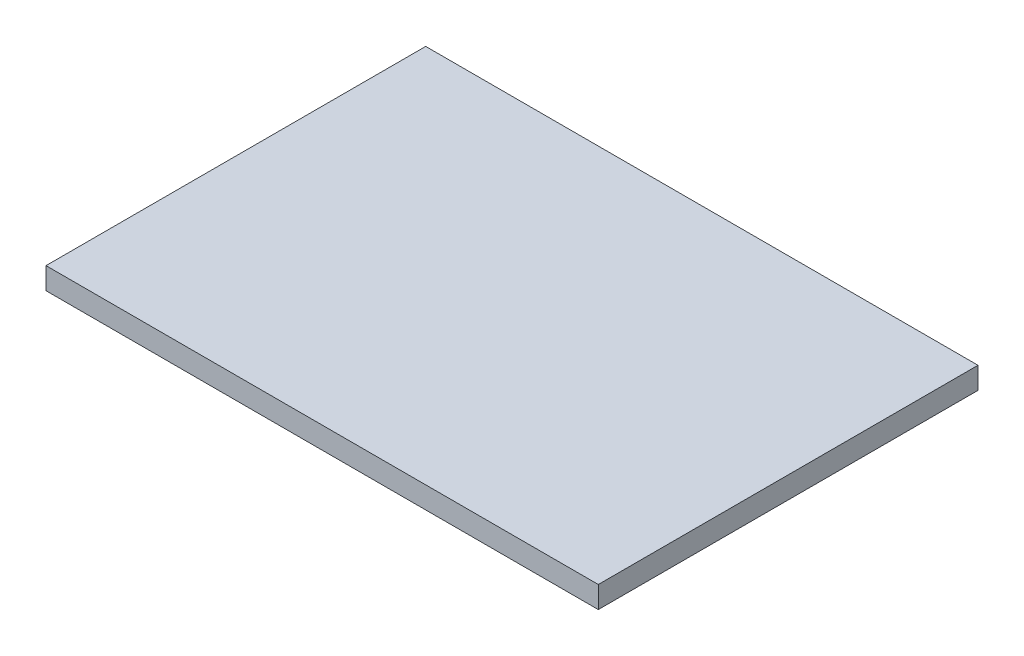
ISO-10303-21;
HEADER;
FILE_DESCRIPTION(('STEP AP214'),'2;1');
FILE_NAME('part.step','',(''),(''),'','','');
FILE_SCHEMA(('AUTOMOTIVE_DESIGN { 1 0 10303 214 1 1 1 1 }'));
ENDSEC;
DATA;
#1=APPLICATION_CONTEXT('core data for automotive mechanical design processes');
#2=APPLICATION_PROTOCOL_DEFINITION('international standard','automotive_design',2000,#1);
#3=PRODUCT_CONTEXT('',#1,'mechanical');
#4=PRODUCT('Part','Part','',(#3));
#5=PRODUCT_RELATED_PRODUCT_CATEGORY('part','',(#4));
#6=PRODUCT_DEFINITION_FORMATION('','',#4);
#7=PRODUCT_DEFINITION_CONTEXT('part definition',#1,'design');
#8=PRODUCT_DEFINITION('design','',#6,#7);
#9=PRODUCT_DEFINITION_SHAPE('','',#8);
#10=(LENGTH_UNIT() NAMED_UNIT(*) SI_UNIT(.MILLI.,.METRE.));
#11=(NAMED_UNIT(*) PLANE_ANGLE_UNIT() SI_UNIT($,.RADIAN.));
#12=(NAMED_UNIT(*) SI_UNIT($,.STERADIAN.) SOLID_ANGLE_UNIT());
#13=UNCERTAINTY_MEASURE_WITH_UNIT(LENGTH_MEASURE(1.E-05),#10,'distance_accuracy_value','');
#14=(GEOMETRIC_REPRESENTATION_CONTEXT(3) GLOBAL_UNCERTAINTY_ASSIGNED_CONTEXT((#13)) GLOBAL_UNIT_ASSIGNED_CONTEXT((#10,
#11,#12)) REPRESENTATION_CONTEXT('',''));
#15=CARTESIAN_POINT('',(0.,0.,0.));
#16=DIRECTION('',(0.,0.,1.));
#17=DIRECTION('',(1.,0.,0.));
#18=AXIS2_PLACEMENT_3D('',#15,#16,#17);
#19=CARTESIAN_POINT('',(-406.4,32.,279.4));
#20=DIRECTION('',(1.,0.,0.));
#21=DIRECTION('',(0.,0.,-1.));
#22=AXIS2_PLACEMENT_3D('',#19,#20,#21);
#23=PLANE('',#22);
#24=DIRECTION('',(0.,0.,1.));
#25=VECTOR('',#24,1.);
#26=CARTESIAN_POINT('',(-406.4,0.,279.4));
#27=LINE('',#26,#25);
#28=CARTESIAN_POINT('',(-406.4,0.,-279.4));
#29=VERTEX_POINT('',#28);
#30=CARTESIAN_POINT('',(-406.4,0.,279.4));
#31=VERTEX_POINT('',#30);
#32=EDGE_CURVE('E107',#29,#31,#27,.T.);
#33=ORIENTED_EDGE('',*,*,#32,.T.);
#34=DIRECTION('',(0.,-1.,0.));
#35=VECTOR('',#34,1.);
#36=CARTESIAN_POINT('',(-406.4,32.,279.4));
#37=LINE('',#36,#35);
#38=CARTESIAN_POINT('',(-406.4,32.,279.4));
#39=VERTEX_POINT('',#38);
#40=EDGE_CURVE('E11',#39,#31,#37,.T.);
#41=ORIENTED_EDGE('',*,*,#40,.F.);
#42=DIRECTION('',(0.,0.,1.));
#43=VECTOR('',#42,1.);
#44=CARTESIAN_POINT('',(-406.4,32.,279.4));
#45=LINE('',#44,#43);
#46=CARTESIAN_POINT('',(-406.4,32.,-279.4));
#47=VERTEX_POINT('',#46);
#48=EDGE_CURVE('E91',#47,#39,#45,.T.);
#49=ORIENTED_EDGE('',*,*,#48,.F.);
#50=DIRECTION('',(0.,-1.,0.));
#51=VECTOR('',#50,1.);
#52=CARTESIAN_POINT('',(-406.4,32.,-279.4));
#53=LINE('',#52,#51);
#54=EDGE_CURVE('E103',#47,#29,#53,.T.);
#55=ORIENTED_EDGE('',*,*,#54,.T.);
#56=EDGE_LOOP('',(#33,#41,#49,#55));
#57=FACE_BOUND('',#56,.T.);
#58=ADVANCED_FACE('F39',(#57),#23,.F.);
#59=CARTESIAN_POINT('',(406.4,32.,279.4));
#60=DIRECTION('',(0.,0.,-1.));
#61=DIRECTION('',(-1.,0.,0.));
#62=AXIS2_PLACEMENT_3D('',#59,#60,#61);
#63=PLANE('',#62);
#64=DIRECTION('',(1.,0.,0.));
#65=VECTOR('',#64,1.);
#66=CARTESIAN_POINT('',(406.4,0.,279.4));
#67=LINE('',#66,#65);
#68=CARTESIAN_POINT('',(406.4,0.,279.4));
#69=VERTEX_POINT('',#68);
#70=EDGE_CURVE('E96',#31,#69,#67,.T.);
#71=ORIENTED_EDGE('',*,*,#70,.T.);
#72=DIRECTION('',(0.,-1.,0.));
#73=VECTOR('',#72,1.);
#74=CARTESIAN_POINT('',(406.4,32.,279.4));
#75=LINE('',#74,#73);
#76=CARTESIAN_POINT('',(406.4,32.,279.4));
#77=VERTEX_POINT('',#76);
#78=EDGE_CURVE('E48',#77,#69,#75,.T.);
#79=ORIENTED_EDGE('',*,*,#78,.F.);
#80=DIRECTION('',(1.,0.,0.));
#81=VECTOR('',#80,1.);
#82=CARTESIAN_POINT('',(406.4,32.,279.4));
#83=LINE('',#82,#81);
#84=EDGE_CURVE('E86',#39,#77,#83,.T.);
#85=ORIENTED_EDGE('',*,*,#84,.F.);
#86=ORIENTED_EDGE('',*,*,#40,.T.);
#87=EDGE_LOOP('',(#71,#79,#85,#86));
#88=FACE_BOUND('',#87,.T.);
#89=ADVANCED_FACE('F95',(#88),#63,.F.);
#90=CARTESIAN_POINT('',(406.4,32.,279.4));
#91=DIRECTION('',(-1.,0.,0.));
#92=DIRECTION('',(0.,0.,1.));
#93=AXIS2_PLACEMENT_3D('',#90,#91,#92);
#94=PLANE('',#93);
#95=DIRECTION('',(0.,0.,-1.));
#96=VECTOR('',#95,1.);
#97=CARTESIAN_POINT('',(406.4,0.,279.4));
#98=LINE('',#97,#96);
#99=CARTESIAN_POINT('',(406.4,0.,-279.4));
#100=VERTEX_POINT('',#99);
#101=EDGE_CURVE('E73',#69,#100,#98,.T.);
#102=ORIENTED_EDGE('',*,*,#101,.T.);
#103=DIRECTION('',(0.,-1.,0.));
#104=VECTOR('',#103,1.);
#105=CARTESIAN_POINT('',(406.4,32.,-279.4));
#106=LINE('',#105,#104);
#107=CARTESIAN_POINT('',(406.4,32.,-279.4));
#108=VERTEX_POINT('',#107);
#109=EDGE_CURVE('E98',#108,#100,#106,.T.);
#110=ORIENTED_EDGE('',*,*,#109,.F.);
#111=DIRECTION('',(0.,0.,-1.));
#112=VECTOR('',#111,1.);
#113=CARTESIAN_POINT('',(406.4,32.,279.4));
#114=LINE('',#113,#112);
#115=EDGE_CURVE('E89',#77,#108,#114,.T.);
#116=ORIENTED_EDGE('',*,*,#115,.F.);
#117=ORIENTED_EDGE('',*,*,#78,.T.);
#118=EDGE_LOOP('',(#102,#110,#116,#117));
#119=FACE_BOUND('',#118,.T.);
#120=ADVANCED_FACE('F99',(#119),#94,.F.);
#121=CARTESIAN_POINT('',(406.4,32.,-279.4));
#122=DIRECTION('',(0.,0.,1.));
#123=DIRECTION('',(1.,0.,0.));
#124=AXIS2_PLACEMENT_3D('',#121,#122,#123);
#125=PLANE('',#124);
#126=DIRECTION('',(-1.,0.,0.));
#127=VECTOR('',#126,1.);
#128=CARTESIAN_POINT('',(406.4,0.,-279.4));
#129=LINE('',#128,#127);
#130=EDGE_CURVE('E79',#100,#29,#129,.T.);
#131=ORIENTED_EDGE('',*,*,#130,.T.);
#132=ORIENTED_EDGE('',*,*,#54,.F.);
#133=DIRECTION('',(-1.,0.,0.));
#134=VECTOR('',#133,1.);
#135=CARTESIAN_POINT('',(406.4,32.,-279.4));
#136=LINE('',#135,#134);
#137=EDGE_CURVE('E56',#108,#47,#136,.T.);
#138=ORIENTED_EDGE('',*,*,#137,.F.);
#139=ORIENTED_EDGE('',*,*,#109,.T.);
#140=EDGE_LOOP('',(#131,#132,#138,#139));
#141=FACE_BOUND('',#140,.T.);
#142=ADVANCED_FACE('F120',(#141),#125,.F.);
#143=CARTESIAN_POINT('',(0.,32.,0.));
#144=DIRECTION('',(0.,1.,0.));
#145=DIRECTION('',(0.,0.,1.));
#146=AXIS2_PLACEMENT_3D('',#143,#144,#145);
#147=PLANE('',#146);
#148=ORIENTED_EDGE('',*,*,#48,.T.);
#149=ORIENTED_EDGE('',*,*,#84,.T.);
#150=ORIENTED_EDGE('',*,*,#115,.T.);
#151=ORIENTED_EDGE('',*,*,#137,.T.);
#152=EDGE_LOOP('',(#148,#149,#150,#151));
#153=FACE_BOUND('',#152,.T.);
#154=ADVANCED_FACE('F87',(#153),#147,.T.);
#155=CARTESIAN_POINT('',(0.,0.,0.));
#156=DIRECTION('',(0.,1.,0.));
#157=DIRECTION('',(0.,0.,1.));
#158=AXIS2_PLACEMENT_3D('',#155,#156,#157);
#159=PLANE('',#158);
#160=ORIENTED_EDGE('',*,*,#32,.F.);
#161=ORIENTED_EDGE('',*,*,#130,.F.);
#162=ORIENTED_EDGE('',*,*,#101,.F.);
#163=ORIENTED_EDGE('',*,*,#70,.F.);
#164=EDGE_LOOP('',(#160,#161,#162,#163));
#165=FACE_BOUND('',#164,.T.);
#166=ADVANCED_FACE('F123',(#165),#159,.F.);
#167=CLOSED_SHELL('',(#58,#89,#120,#142,#154,#166));
#168=MANIFOLD_SOLID_BREP('B2',#167);
#169=ADVANCED_BREP_SHAPE_REPRESENTATION('',(#18,#168),#14);
#170=SHAPE_DEFINITION_REPRESENTATION(#9,#169);
ENDSEC;
END-ISO-10303-21;
